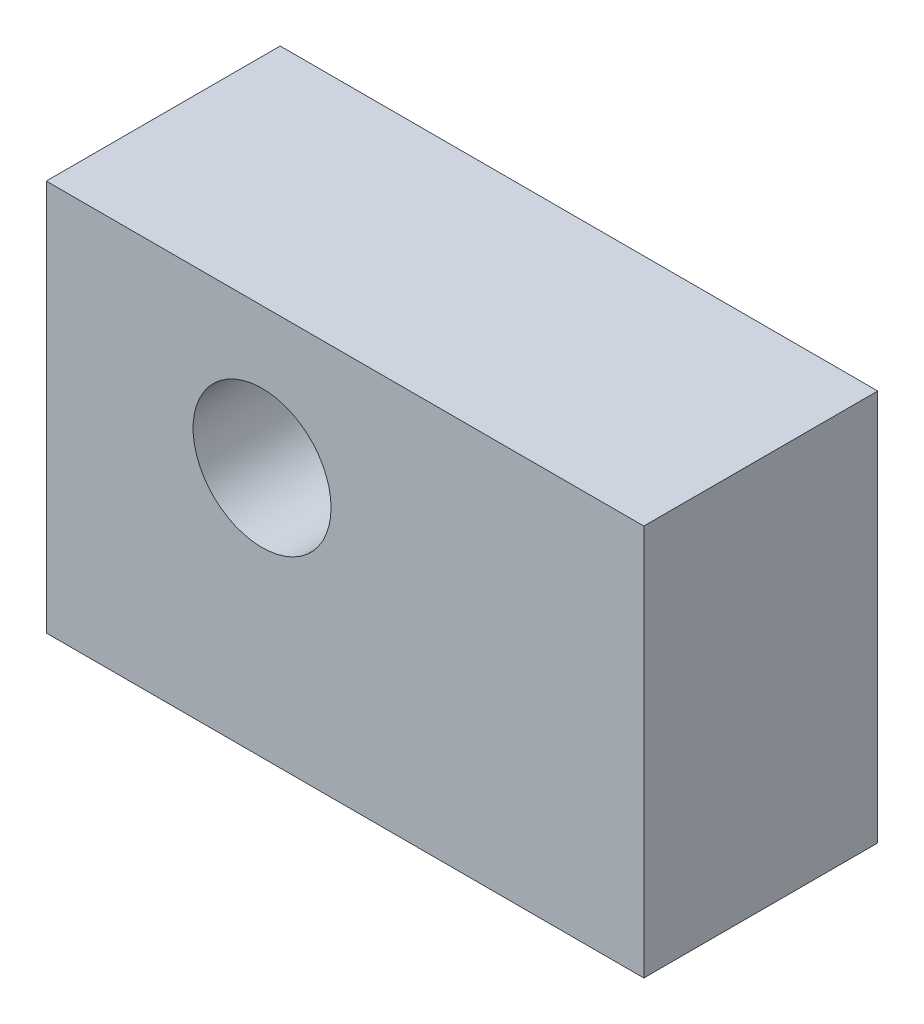
ISO-10303-21;
HEADER;
FILE_DESCRIPTION(('STEP AP214'),'2;1');
FILE_NAME('part.step','',(''),(''),'','','');
FILE_SCHEMA(('AUTOMOTIVE_DESIGN { 1 0 10303 214 1 1 1 1 }'));
ENDSEC;
DATA;
#1=APPLICATION_CONTEXT('core data for automotive mechanical design processes');
#2=APPLICATION_PROTOCOL_DEFINITION('international standard','automotive_design',2000,#1);
#3=PRODUCT_CONTEXT('',#1,'mechanical');
#4=PRODUCT('Part','Part','',(#3));
#5=PRODUCT_RELATED_PRODUCT_CATEGORY('part','',(#4));
#6=PRODUCT_DEFINITION_FORMATION('','',#4);
#7=PRODUCT_DEFINITION_CONTEXT('part definition',#1,'design');
#8=PRODUCT_DEFINITION('design','',#6,#7);
#9=PRODUCT_DEFINITION_SHAPE('','',#8);
#10=(LENGTH_UNIT() NAMED_UNIT(*) SI_UNIT(.MILLI.,.METRE.));
#11=(NAMED_UNIT(*) PLANE_ANGLE_UNIT() SI_UNIT($,.RADIAN.));
#12=(NAMED_UNIT(*) SI_UNIT($,.STERADIAN.) SOLID_ANGLE_UNIT());
#13=UNCERTAINTY_MEASURE_WITH_UNIT(LENGTH_MEASURE(1.E-05),#10,'distance_accuracy_value','');
#14=(GEOMETRIC_REPRESENTATION_CONTEXT(3) GLOBAL_UNCERTAINTY_ASSIGNED_CONTEXT((#13)) GLOBAL_UNIT_ASSIGNED_CONTEXT((#10,
#11,#12)) REPRESENTATION_CONTEXT('',''));
#15=CARTESIAN_POINT('',(0.,0.,0.));
#16=DIRECTION('',(0.,0.,1.));
#17=DIRECTION('',(1.,0.,0.));
#18=AXIS2_PLACEMENT_3D('',#15,#16,#17);
#19=CARTESIAN_POINT('',(-32.48,-25.74,13.955));
#20=DIRECTION('',(1.,0.,0.));
#21=DIRECTION('',(0.,0.,-1.));
#22=AXIS2_PLACEMENT_3D('',#19,#20,#21);
#23=PLANE('',#22);
#24=DIRECTION('',(0.,-1.,0.));
#25=VECTOR('',#24,1.);
#26=CARTESIAN_POINT('',(-32.48,-25.74,-13.955));
#27=LINE('',#26,#25);
#28=CARTESIAN_POINT('',(-32.48,20.96,-13.955));
#29=VERTEX_POINT('',#28);
#30=CARTESIAN_POINT('',(-32.48,-25.74,-13.955));
#31=VERTEX_POINT('',#30);
#32=EDGE_CURVE('E102',#29,#31,#27,.T.);
#33=ORIENTED_EDGE('',*,*,#32,.T.);
#34=DIRECTION('',(0.,0.,-1.));
#35=VECTOR('',#34,1.);
#36=CARTESIAN_POINT('',(-32.48,-25.74,13.955));
#37=LINE('',#36,#35);
#38=CARTESIAN_POINT('',(-32.48,-25.74,13.955));
#39=VERTEX_POINT('',#38);
#40=EDGE_CURVE('E11',#39,#31,#37,.T.);
#41=ORIENTED_EDGE('',*,*,#40,.F.);
#42=DIRECTION('',(0.,-1.,0.));
#43=VECTOR('',#42,1.);
#44=CARTESIAN_POINT('',(-32.48,-25.74,13.955));
#45=LINE('',#44,#43);
#46=CARTESIAN_POINT('',(-32.48,20.96,13.955));
#47=VERTEX_POINT('',#46);
#48=EDGE_CURVE('E95',#47,#39,#45,.T.);
#49=ORIENTED_EDGE('',*,*,#48,.F.);
#50=DIRECTION('',(0.,0.,-1.));
#51=VECTOR('',#50,1.);
#52=CARTESIAN_POINT('',(-32.48,20.96,13.955));
#53=LINE('',#52,#51);
#54=EDGE_CURVE('E99',#47,#29,#53,.T.);
#55=ORIENTED_EDGE('',*,*,#54,.T.);
#56=EDGE_LOOP('',(#33,#41,#49,#55));
#57=FACE_BOUND('',#56,.T.);
#58=ADVANCED_FACE('F41',(#57),#23,.F.);
#59=CARTESIAN_POINT('',(-32.48,-25.74,13.955));
#60=DIRECTION('',(0.,1.,0.));
#61=DIRECTION('',(0.,0.,1.));
#62=AXIS2_PLACEMENT_3D('',#59,#60,#61);
#63=PLANE('',#62);
#64=DIRECTION('',(1.,0.,0.));
#65=VECTOR('',#64,1.);
#66=CARTESIAN_POINT('',(-32.48,-25.74,-13.955));
#67=LINE('',#66,#65);
#68=CARTESIAN_POINT('',(38.82,-25.74,-13.955));
#69=VERTEX_POINT('',#68);
#70=EDGE_CURVE('E96',#31,#69,#67,.T.);
#71=ORIENTED_EDGE('',*,*,#70,.T.);
#72=DIRECTION('',(0.,0.,-1.));
#73=VECTOR('',#72,1.);
#74=CARTESIAN_POINT('',(38.82,-25.74,13.955));
#75=LINE('',#74,#73);
#76=CARTESIAN_POINT('',(38.82,-25.74,13.955));
#77=VERTEX_POINT('',#76);
#78=EDGE_CURVE('E47',#77,#69,#75,.T.);
#79=ORIENTED_EDGE('',*,*,#78,.F.);
#80=DIRECTION('',(1.,0.,0.));
#81=VECTOR('',#80,1.);
#82=CARTESIAN_POINT('',(-32.48,-25.74,13.955));
#83=LINE('',#82,#81);
#84=EDGE_CURVE('E87',#39,#77,#83,.T.);
#85=ORIENTED_EDGE('',*,*,#84,.F.);
#86=ORIENTED_EDGE('',*,*,#40,.T.);
#87=EDGE_LOOP('',(#71,#79,#85,#86));
#88=FACE_BOUND('',#87,.T.);
#89=ADVANCED_FACE('F92',(#88),#63,.F.);
#90=CARTESIAN_POINT('',(38.82,-25.74,13.955));
#91=DIRECTION('',(-1.,0.,0.));
#92=DIRECTION('',(0.,0.,1.));
#93=AXIS2_PLACEMENT_3D('',#90,#91,#92);
#94=PLANE('',#93);
#95=DIRECTION('',(0.,1.,0.));
#96=VECTOR('',#95,1.);
#97=CARTESIAN_POINT('',(38.82,-25.74,-13.955));
#98=LINE('',#97,#96);
#99=CARTESIAN_POINT('',(38.82,20.96,-13.955));
#100=VERTEX_POINT('',#99);
#101=EDGE_CURVE('E74',#69,#100,#98,.T.);
#102=ORIENTED_EDGE('',*,*,#101,.T.);
#103=DIRECTION('',(0.,0.,-1.));
#104=VECTOR('',#103,1.);
#105=CARTESIAN_POINT('',(38.82,20.96,13.955));
#106=LINE('',#105,#104);
#107=CARTESIAN_POINT('',(38.82,20.96,13.955));
#108=VERTEX_POINT('',#107);
#109=EDGE_CURVE('E100',#108,#100,#106,.T.);
#110=ORIENTED_EDGE('',*,*,#109,.F.);
#111=DIRECTION('',(0.,1.,0.));
#112=VECTOR('',#111,1.);
#113=CARTESIAN_POINT('',(38.82,-25.74,13.955));
#114=LINE('',#113,#112);
#115=EDGE_CURVE('E89',#77,#108,#114,.T.);
#116=ORIENTED_EDGE('',*,*,#115,.F.);
#117=ORIENTED_EDGE('',*,*,#78,.T.);
#118=EDGE_LOOP('',(#102,#110,#116,#117));
#119=FACE_BOUND('',#118,.T.);
#120=ADVANCED_FACE('F98',(#119),#94,.F.);
#121=CARTESIAN_POINT('',(-32.48,20.96,13.955));
#122=DIRECTION('',(0.,-1.,0.));
#123=DIRECTION('',(0.,0.,-1.));
#124=AXIS2_PLACEMENT_3D('',#121,#122,#123);
#125=PLANE('',#124);
#126=DIRECTION('',(-1.,0.,0.));
#127=VECTOR('',#126,1.);
#128=CARTESIAN_POINT('',(-32.48,20.96,-13.955));
#129=LINE('',#128,#127);
#130=EDGE_CURVE('E78',#100,#29,#129,.T.);
#131=ORIENTED_EDGE('',*,*,#130,.T.);
#132=ORIENTED_EDGE('',*,*,#54,.F.);
#133=DIRECTION('',(-1.,0.,0.));
#134=VECTOR('',#133,1.);
#135=CARTESIAN_POINT('',(-32.48,20.96,13.955));
#136=LINE('',#135,#134);
#137=EDGE_CURVE('E60',#108,#47,#136,.T.);
#138=ORIENTED_EDGE('',*,*,#137,.F.);
#139=ORIENTED_EDGE('',*,*,#109,.T.);
#140=EDGE_LOOP('',(#131,#132,#138,#139));
#141=FACE_BOUND('',#140,.T.);
#142=ADVANCED_FACE('F115',(#141),#125,.F.);
#143=CARTESIAN_POINT('',(0.,0.,13.955));
#144=DIRECTION('',(0.,0.,-1.));
#145=DIRECTION('',(-1.,0.,0.));
#146=AXIS2_PLACEMENT_3D('',#143,#144,#145);
#147=PLANE('',#146);
#148=CARTESIAN_POINT('',(-6.73,4.19,13.955));
#149=DIRECTION('',(0.,0.,1.));
#150=DIRECTION('',(1.,0.,0.));
#151=AXIS2_PLACEMENT_3D('',#148,#149,#150);
#152=CIRCLE('',#151,8.23);
#153=CARTESIAN_POINT('',(1.5,4.19,13.955));
#154=VERTEX_POINT('',#153);
#155=EDGE_CURVE('E110',#154,#154,#152,.T.);
#156=ORIENTED_EDGE('',*,*,#155,.F.);
#157=EDGE_LOOP('',(#156));
#158=FACE_BOUND('',#157,.T.);
#159=ORIENTED_EDGE('',*,*,#48,.T.);
#160=ORIENTED_EDGE('',*,*,#84,.T.);
#161=ORIENTED_EDGE('',*,*,#115,.T.);
#162=ORIENTED_EDGE('',*,*,#137,.T.);
#163=EDGE_LOOP('',(#159,#160,#161,#162));
#164=FACE_BOUND('',#163,.T.);
#165=ADVANCED_FACE('F86',(#158,#164),#147,.F.);
#166=CARTESIAN_POINT('',(0.,0.,-13.955));
#167=DIRECTION('',(0.,0.,-1.));
#168=DIRECTION('',(-1.,0.,0.));
#169=AXIS2_PLACEMENT_3D('',#166,#167,#168);
#170=PLANE('',#169);
#171=ORIENTED_EDGE('',*,*,#32,.F.);
#172=ORIENTED_EDGE('',*,*,#130,.F.);
#173=ORIENTED_EDGE('',*,*,#101,.F.);
#174=ORIENTED_EDGE('',*,*,#70,.F.);
#175=EDGE_LOOP('',(#171,#172,#173,#174));
#176=FACE_BOUND('',#175,.T.);
#177=ADVANCED_FACE('F113',(#176),#170,.T.);
#178=CARTESIAN_POINT('',(-6.73,4.19,13.955));
#179=DIRECTION('',(0.,0.,-1.));
#180=DIRECTION('',(-1.,0.,0.));
#181=AXIS2_PLACEMENT_3D('',#178,#179,#180);
#182=CYLINDRICAL_SURFACE('',#181,8.23);
#183=ORIENTED_EDGE('',*,*,#155,.T.);
#184=EDGE_LOOP('',(#183));
#185=FACE_BOUND('',#184,.T.);
#186=CARTESIAN_POINT('',(-6.73,4.19,0.));
#187=DIRECTION('',(0.,0.,1.));
#188=DIRECTION('',(1.,0.,0.));
#189=AXIS2_PLACEMENT_3D('',#186,#187,#188);
#190=CIRCLE('',#189,8.23);
#191=CARTESIAN_POINT('',(1.5,4.19,0.));
#192=VERTEX_POINT('',#191);
#193=EDGE_CURVE('E119',#192,#192,#190,.T.);
#194=ORIENTED_EDGE('',*,*,#193,.F.);
#195=EDGE_LOOP('',(#194));
#196=FACE_BOUND('',#195,.T.);
#197=ADVANCED_FACE('F123',(#185,#196),#182,.F.);
#198=CARTESIAN_POINT('',(-6.73,4.19,0.));
#199=DIRECTION('',(0.,0.,1.));
#200=DIRECTION('',(1.,0.,0.));
#201=AXIS2_PLACEMENT_3D('',#198,#199,#200);
#202=PLANE('',#201);
#203=ORIENTED_EDGE('',*,*,#193,.T.);
#204=EDGE_LOOP('',(#203));
#205=FACE_BOUND('',#204,.T.);
#206=ADVANCED_FACE('F166',(#205),#202,.T.);
#207=CLOSED_SHELL('',(#58,#89,#120,#142,#165,#177,#197,#206));
#208=MANIFOLD_SOLID_BREP('B2',#207);
#209=ADVANCED_BREP_SHAPE_REPRESENTATION('',(#18,#208),#14);
#210=SHAPE_DEFINITION_REPRESENTATION(#9,#209);
ENDSEC;
END-ISO-10303-21;
